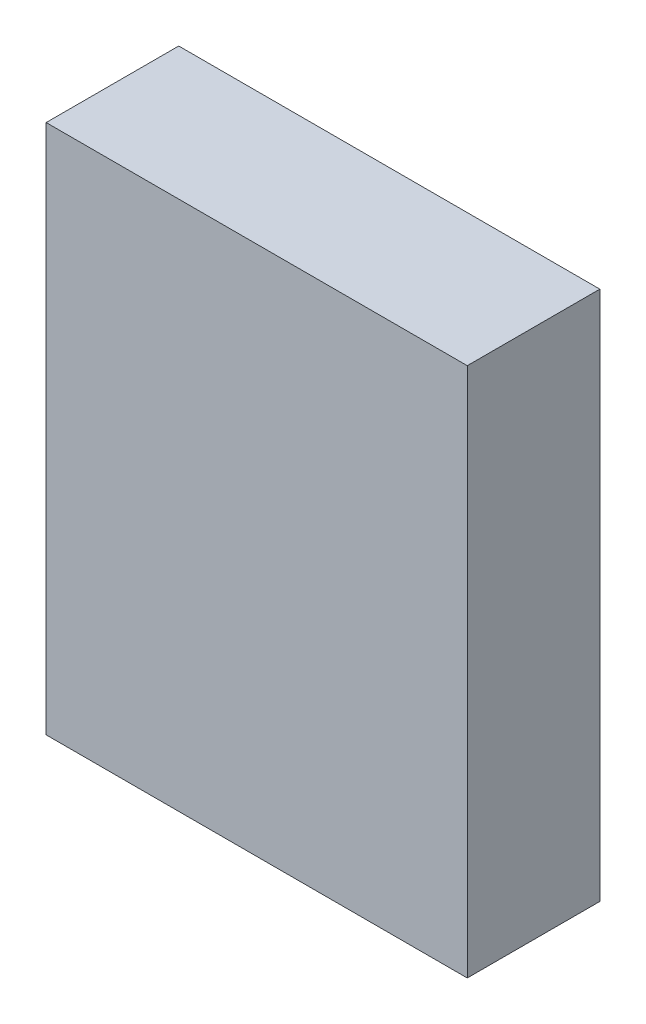
ISO-10303-21;
HEADER;
FILE_DESCRIPTION(('STEP AP214'),'2;1');
FILE_NAME('part.step','',(''),(''),'','','');
FILE_SCHEMA(('AUTOMOTIVE_DESIGN { 1 0 10303 214 1 1 1 1 }'));
ENDSEC;
DATA;
#1=APPLICATION_CONTEXT('core data for automotive mechanical design processes');
#2=APPLICATION_PROTOCOL_DEFINITION('international standard','automotive_design',2000,#1);
#3=PRODUCT_CONTEXT('',#1,'mechanical');
#4=PRODUCT('Part','Part','',(#3));
#5=PRODUCT_RELATED_PRODUCT_CATEGORY('part','',(#4));
#6=PRODUCT_DEFINITION_FORMATION('','',#4);
#7=PRODUCT_DEFINITION_CONTEXT('part definition',#1,'design');
#8=PRODUCT_DEFINITION('design','',#6,#7);
#9=PRODUCT_DEFINITION_SHAPE('','',#8);
#10=(LENGTH_UNIT() NAMED_UNIT(*) SI_UNIT(.MILLI.,.METRE.));
#11=(NAMED_UNIT(*) PLANE_ANGLE_UNIT() SI_UNIT($,.RADIAN.));
#12=(NAMED_UNIT(*) SI_UNIT($,.STERADIAN.) SOLID_ANGLE_UNIT());
#13=UNCERTAINTY_MEASURE_WITH_UNIT(LENGTH_MEASURE(1.E-05),#10,'distance_accuracy_value','');
#14=(GEOMETRIC_REPRESENTATION_CONTEXT(3) GLOBAL_UNCERTAINTY_ASSIGNED_CONTEXT((#13)) GLOBAL_UNIT_ASSIGNED_CONTEXT((#10,
#11,#12)) REPRESENTATION_CONTEXT('',''));
#15=CARTESIAN_POINT('',(0.,0.,0.));
#16=DIRECTION('',(0.,0.,1.));
#17=DIRECTION('',(1.,0.,0.));
#18=AXIS2_PLACEMENT_3D('',#15,#16,#17);
#19=CARTESIAN_POINT('',(1.34999984,-1.69999914,0.85000084));
#20=DIRECTION('',(0.,0.,-1.));
#21=DIRECTION('',(-1.,0.,0.));
#22=AXIS2_PLACEMENT_3D('',#19,#20,#21);
#23=PLANE('',#22);
#24=DIRECTION('',(1.,0.,0.));
#25=VECTOR('',#24,1.);
#26=CARTESIAN_POINT('',(1.34999984,1.69999914,0.85000084));
#27=LINE('',#26,#25);
#28=CARTESIAN_POINT('',(1.34999984,1.69999914,0.85000084));
#29=VERTEX_POINT('',#28);
#30=CARTESIAN_POINT('',(-1.34999984,1.69999914,0.85000084));
#31=VERTEX_POINT('',#30);
#32=EDGE_CURVE('E54',#29,#31,#27,.F.);
#33=ORIENTED_EDGE('',*,*,#32,.T.);
#34=DIRECTION('',(0.,1.,0.));
#35=VECTOR('',#34,1.);
#36=CARTESIAN_POINT('',(-1.34999984,1.69999914,0.85000084));
#37=LINE('',#36,#35);
#38=CARTESIAN_POINT('',(-1.34999984,-1.69999914,0.85000084));
#39=VERTEX_POINT('',#38);
#40=EDGE_CURVE('E56',#31,#39,#37,.F.);
#41=ORIENTED_EDGE('',*,*,#40,.T.);
#42=DIRECTION('',(1.,0.,0.));
#43=VECTOR('',#42,1.);
#44=CARTESIAN_POINT('',(-1.34999984,-1.69999914,0.85000084));
#45=LINE('',#44,#43);
#46=CARTESIAN_POINT('',(1.34999984,-1.69999914,0.85000084));
#47=VERTEX_POINT('',#46);
#48=EDGE_CURVE('E19',#39,#47,#45,.T.);
#49=ORIENTED_EDGE('',*,*,#48,.T.);
#50=DIRECTION('',(0.,1.,0.));
#51=VECTOR('',#50,1.);
#52=CARTESIAN_POINT('',(1.34999984,-1.69999914,0.85000084));
#53=LINE('',#52,#51);
#54=EDGE_CURVE('E79',#47,#29,#53,.T.);
#55=ORIENTED_EDGE('',*,*,#54,.T.);
#56=EDGE_LOOP('',(#33,#41,#49,#55));
#57=FACE_BOUND('',#56,.T.);
#58=ADVANCED_FACE('F16',(#57),#23,.F.);
#59=CARTESIAN_POINT('',(-1.34999984,-1.69999914,0.));
#60=DIRECTION('',(0.,1.,0.));
#61=DIRECTION('',(0.,0.,1.));
#62=AXIS2_PLACEMENT_3D('',#59,#60,#61);
#63=PLANE('',#62);
#64=DIRECTION('',(0.,0.,1.));
#65=VECTOR('',#64,1.);
#66=CARTESIAN_POINT('',(1.34999984,-1.69999914,0.));
#67=LINE('',#66,#65);
#68=CARTESIAN_POINT('',(1.34999984,-1.69999914,0.));
#69=VERTEX_POINT('',#68);
#70=EDGE_CURVE('E67',#69,#47,#67,.T.);
#71=ORIENTED_EDGE('',*,*,#70,.T.);
#72=ORIENTED_EDGE('',*,*,#48,.F.);
#73=DIRECTION('',(0.,0.,-1.));
#74=VECTOR('',#73,1.);
#75=CARTESIAN_POINT('',(-1.34999984,-1.69999914,0.));
#76=LINE('',#75,#74);
#77=CARTESIAN_POINT('',(-1.34999984,-1.69999914,0.));
#78=VERTEX_POINT('',#77);
#79=EDGE_CURVE('E62',#39,#78,#76,.T.);
#80=ORIENTED_EDGE('',*,*,#79,.T.);
#81=DIRECTION('',(-1.,0.,0.));
#82=VECTOR('',#81,1.);
#83=CARTESIAN_POINT('',(1.34999984,-1.69999914,0.));
#84=LINE('',#83,#82);
#85=EDGE_CURVE('E82',#69,#78,#84,.T.);
#86=ORIENTED_EDGE('',*,*,#85,.F.);
#87=EDGE_LOOP('',(#71,#72,#80,#86));
#88=FACE_BOUND('',#87,.T.);
#89=ADVANCED_FACE('F64',(#88),#63,.F.);
#90=CARTESIAN_POINT('',(-1.34999984,1.69999914,0.));
#91=DIRECTION('',(1.,0.,0.));
#92=DIRECTION('',(0.,0.,-1.));
#93=AXIS2_PLACEMENT_3D('',#90,#91,#92);
#94=PLANE('',#93);
#95=ORIENTED_EDGE('',*,*,#79,.F.);
#96=ORIENTED_EDGE('',*,*,#40,.F.);
#97=DIRECTION('',(0.,0.,-1.));
#98=VECTOR('',#97,1.);
#99=CARTESIAN_POINT('',(-1.34999984,1.69999914,0.));
#100=LINE('',#99,#98);
#101=CARTESIAN_POINT('',(-1.34999984,1.69999914,0.));
#102=VERTEX_POINT('',#101);
#103=EDGE_CURVE('E74',#31,#102,#100,.T.);
#104=ORIENTED_EDGE('',*,*,#103,.T.);
#105=DIRECTION('',(0.,1.,0.));
#106=VECTOR('',#105,1.);
#107=CARTESIAN_POINT('',(-1.34999984,-1.69999914,0.));
#108=LINE('',#107,#106);
#109=EDGE_CURVE('E71',#78,#102,#108,.T.);
#110=ORIENTED_EDGE('',*,*,#109,.F.);
#111=EDGE_LOOP('',(#95,#96,#104,#110));
#112=FACE_BOUND('',#111,.T.);
#113=ADVANCED_FACE('F69',(#112),#94,.F.);
#114=CARTESIAN_POINT('',(1.34999984,1.69999914,0.));
#115=DIRECTION('',(0.,-1.,0.));
#116=DIRECTION('',(0.,0.,-1.));
#117=AXIS2_PLACEMENT_3D('',#114,#115,#116);
#118=PLANE('',#117);
#119=ORIENTED_EDGE('',*,*,#103,.F.);
#120=ORIENTED_EDGE('',*,*,#32,.F.);
#121=DIRECTION('',(0.,0.,1.));
#122=VECTOR('',#121,1.);
#123=CARTESIAN_POINT('',(1.34999984,1.69999914,0.));
#124=LINE('',#123,#122);
#125=CARTESIAN_POINT('',(1.34999984,1.69999914,0.));
#126=VERTEX_POINT('',#125);
#127=EDGE_CURVE('E34',#29,#126,#124,.F.);
#128=ORIENTED_EDGE('',*,*,#127,.T.);
#129=DIRECTION('',(-1.,0.,0.));
#130=VECTOR('',#129,1.);
#131=CARTESIAN_POINT('',(1.34999984,1.69999914,0.));
#132=LINE('',#131,#130);
#133=EDGE_CURVE('E25',#102,#126,#132,.F.);
#134=ORIENTED_EDGE('',*,*,#133,.F.);
#135=EDGE_LOOP('',(#119,#120,#128,#134));
#136=FACE_BOUND('',#135,.T.);
#137=ADVANCED_FACE('F88',(#136),#118,.F.);
#138=CARTESIAN_POINT('',(1.34999984,-1.69999914,0.));
#139=DIRECTION('',(-1.,0.,0.));
#140=DIRECTION('',(0.,0.,1.));
#141=AXIS2_PLACEMENT_3D('',#138,#139,#140);
#142=PLANE('',#141);
#143=ORIENTED_EDGE('',*,*,#127,.F.);
#144=ORIENTED_EDGE('',*,*,#54,.F.);
#145=ORIENTED_EDGE('',*,*,#70,.F.);
#146=DIRECTION('',(0.,1.,0.));
#147=VECTOR('',#146,1.);
#148=CARTESIAN_POINT('',(1.34999984,-1.69999914,0.));
#149=LINE('',#148,#147);
#150=EDGE_CURVE('E11',#126,#69,#149,.F.);
#151=ORIENTED_EDGE('',*,*,#150,.F.);
#152=EDGE_LOOP('',(#143,#144,#145,#151));
#153=FACE_BOUND('',#152,.T.);
#154=ADVANCED_FACE('F90',(#153),#142,.F.);
#155=CARTESIAN_POINT('',(1.34999984,-1.69999914,0.));
#156=DIRECTION('',(0.,0.,-1.));
#157=DIRECTION('',(-1.,0.,0.));
#158=AXIS2_PLACEMENT_3D('',#155,#156,#157);
#159=PLANE('',#158);
#160=ORIENTED_EDGE('',*,*,#133,.T.);
#161=ORIENTED_EDGE('',*,*,#150,.T.);
#162=ORIENTED_EDGE('',*,*,#85,.T.);
#163=ORIENTED_EDGE('',*,*,#109,.T.);
#164=EDGE_LOOP('',(#160,#161,#162,#163));
#165=FACE_BOUND('',#164,.T.);
#166=ADVANCED_FACE('F87',(#165),#159,.T.);
#167=CLOSED_SHELL('',(#58,#89,#113,#137,#154,#166));
#168=MANIFOLD_SOLID_BREP('B1',#167);
#169=ADVANCED_BREP_SHAPE_REPRESENTATION('',(#18,#168),#14);
#170=SHAPE_DEFINITION_REPRESENTATION(#9,#169);
ENDSEC;
END-ISO-10303-21;
